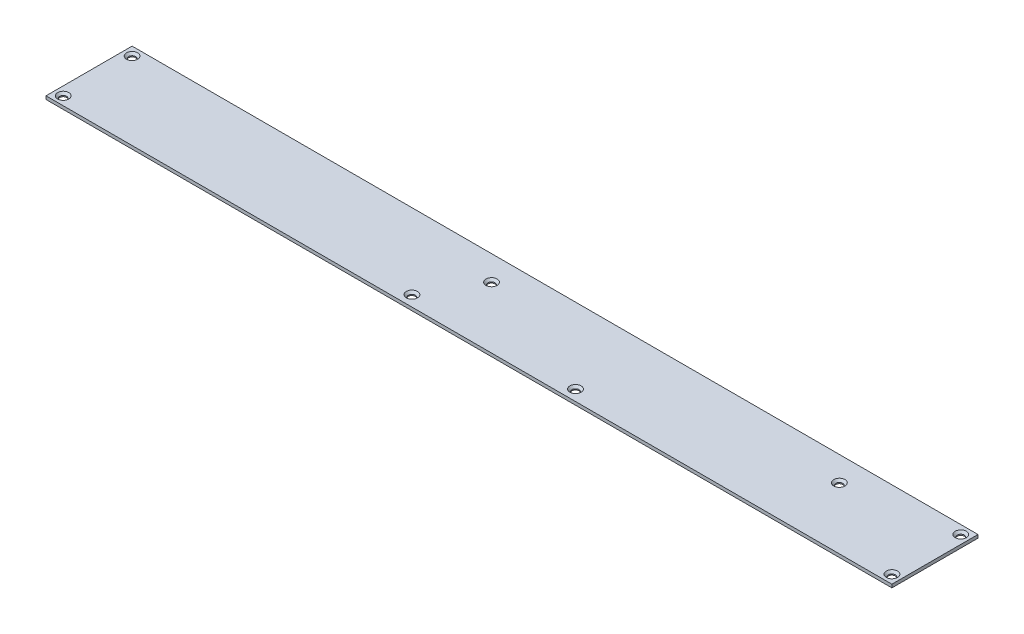
ISO-10303-21;
HEADER;
FILE_DESCRIPTION(('STEP AP214'),'2;1');
FILE_NAME('part.step','',(''),(''),'','','');
FILE_SCHEMA(('AUTOMOTIVE_DESIGN { 1 0 10303 214 1 1 1 1 }'));
ENDSEC;
DATA;
#1=APPLICATION_CONTEXT('core data for automotive mechanical design processes');
#2=APPLICATION_PROTOCOL_DEFINITION('international standard','automotive_design',2000,#1);
#3=PRODUCT_CONTEXT('',#1,'mechanical');
#4=PRODUCT('Part','Part','',(#3));
#5=PRODUCT_RELATED_PRODUCT_CATEGORY('part','',(#4));
#6=PRODUCT_DEFINITION_FORMATION('','',#4);
#7=PRODUCT_DEFINITION_CONTEXT('part definition',#1,'design');
#8=PRODUCT_DEFINITION('design','',#6,#7);
#9=PRODUCT_DEFINITION_SHAPE('','',#8);
#10=(LENGTH_UNIT() NAMED_UNIT(*) SI_UNIT(.MILLI.,.METRE.));
#11=(NAMED_UNIT(*) PLANE_ANGLE_UNIT() SI_UNIT($,.RADIAN.));
#12=(NAMED_UNIT(*) SI_UNIT($,.STERADIAN.) SOLID_ANGLE_UNIT());
#13=UNCERTAINTY_MEASURE_WITH_UNIT(LENGTH_MEASURE(1.E-05),#10,'distance_accuracy_value','');
#14=(GEOMETRIC_REPRESENTATION_CONTEXT(3) GLOBAL_UNCERTAINTY_ASSIGNED_CONTEXT((#13)) GLOBAL_UNIT_ASSIGNED_CONTEXT((#10,
#11,#12)) REPRESENTATION_CONTEXT('',''));
#15=CARTESIAN_POINT('',(0.,0.,0.));
#16=DIRECTION('',(0.,0.,1.));
#17=DIRECTION('',(1.,0.,0.));
#18=AXIS2_PLACEMENT_3D('',#15,#16,#17);
#19=CARTESIAN_POINT('',(0.,1.5,0.));
#20=DIRECTION('',(0.,1.,0.));
#21=DIRECTION('',(0.,0.,1.));
#22=AXIS2_PLACEMENT_3D('',#19,#20,#21);
#23=PLANE('',#22);
#24=CARTESIAN_POINT('',(-18.0000109998269,1.5,-8.50000000000028));
#25=DIRECTION('',(0.,1.,0.));
#26=DIRECTION('',(0.,0.,1.));
#27=AXIS2_PLACEMENT_3D('',#24,#25,#26);
#28=CIRCLE('',#27,2.59999999999994);
#29=CARTESIAN_POINT('',(-18.0000109998269,1.5,-5.90000000000034));
#30=VERTEX_POINT('',#29);
#31=EDGE_CURVE('E147',#30,#30,#28,.F.);
#32=ORIENTED_EDGE('',*,*,#31,.T.);
#33=EDGE_LOOP('',(#32));
#34=FACE_BOUND('',#33,.T.);
#35=CARTESIAN_POINT('',(143.4999640375,1.5,-8.58999977260868));
#36=DIRECTION('',(0.,1.,0.));
#37=DIRECTION('',(0.,0.,1.));
#38=AXIS2_PLACEMENT_3D('',#35,#36,#37);
#39=CIRCLE('',#38,2.59999999999994);
#40=CARTESIAN_POINT('',(143.4999640375,1.5,-5.98999977260874));
#41=VERTEX_POINT('',#40);
#42=EDGE_CURVE('E144',#41,#41,#39,.F.);
#43=ORIENTED_EDGE('',*,*,#42,.T.);
#44=EDGE_LOOP('',(#43));
#45=FACE_BOUND('',#44,.T.);
#46=CARTESIAN_POINT('',(-31.5,1.5,15.));
#47=DIRECTION('',(0.,1.,0.));
#48=DIRECTION('',(0.,0.,1.));
#49=AXIS2_PLACEMENT_3D('',#46,#47,#48);
#50=CIRCLE('',#49,2.59999999999994);
#51=CARTESIAN_POINT('',(-31.5,1.5,17.5999999999999));
#52=VERTEX_POINT('',#51);
#53=EDGE_CURVE('E141',#52,#52,#50,.F.);
#54=ORIENTED_EDGE('',*,*,#53,.T.);
#55=EDGE_LOOP('',(#54));
#56=FACE_BOUND('',#55,.T.);
#57=CARTESIAN_POINT('',(192.5,1.5,-16.));
#58=DIRECTION('',(0.,1.,0.));
#59=DIRECTION('',(0.,0.,1.));
#60=AXIS2_PLACEMENT_3D('',#57,#58,#59);
#61=CIRCLE('',#60,2.59999999999994);
#62=CARTESIAN_POINT('',(192.5,1.5,-13.4000000000001));
#63=VERTEX_POINT('',#62);
#64=EDGE_CURVE('E138',#63,#63,#61,.F.);
#65=ORIENTED_EDGE('',*,*,#64,.T.);
#66=EDGE_LOOP('',(#65));
#67=FACE_BOUND('',#66,.T.);
#68=CARTESIAN_POINT('',(192.5,1.5,16.));
#69=DIRECTION('',(0.,1.,0.));
#70=DIRECTION('',(0.,0.,1.));
#71=AXIS2_PLACEMENT_3D('',#68,#69,#70);
#72=CIRCLE('',#71,2.59999999999999);
#73=CARTESIAN_POINT('',(192.5,1.5,18.6));
#74=VERTEX_POINT('',#73);
#75=EDGE_CURVE('E135',#74,#74,#72,.F.);
#76=ORIENTED_EDGE('',*,*,#75,.T.);
#77=EDGE_LOOP('',(#76));
#78=FACE_BOUND('',#77,.T.);
#79=CARTESIAN_POINT('',(44.5,1.5,15.));
#80=DIRECTION('',(0.,1.,0.));
#81=DIRECTION('',(0.,0.,1.));
#82=AXIS2_PLACEMENT_3D('',#79,#80,#81);
#83=CIRCLE('',#82,2.59999999999994);
#84=CARTESIAN_POINT('',(44.5,1.5,17.5999999999999));
#85=VERTEX_POINT('',#84);
#86=EDGE_CURVE('E132',#85,#85,#83,.F.);
#87=ORIENTED_EDGE('',*,*,#86,.T.);
#88=EDGE_LOOP('',(#87));
#89=FACE_BOUND('',#88,.T.);
#90=CARTESIAN_POINT('',(-192.5,1.5,16.));
#91=DIRECTION('',(0.,1.,0.));
#92=DIRECTION('',(0.,0.,1.));
#93=AXIS2_PLACEMENT_3D('',#90,#91,#92);
#94=CIRCLE('',#93,2.59999999999994);
#95=CARTESIAN_POINT('',(-192.5,1.5,18.5999999999999));
#96=VERTEX_POINT('',#95);
#97=EDGE_CURVE('E129',#96,#96,#94,.F.);
#98=ORIENTED_EDGE('',*,*,#97,.T.);
#99=EDGE_LOOP('',(#98));
#100=FACE_BOUND('',#99,.T.);
#101=CARTESIAN_POINT('',(-192.5,1.5,-16.));
#102=DIRECTION('',(0.,1.,0.));
#103=DIRECTION('',(0.,0.,1.));
#104=AXIS2_PLACEMENT_3D('',#101,#102,#103);
#105=CIRCLE('',#104,2.59999999999999);
#106=CARTESIAN_POINT('',(-192.5,1.5,-13.4));
#107=VERTEX_POINT('',#106);
#108=EDGE_CURVE('E126',#107,#107,#105,.F.);
#109=ORIENTED_EDGE('',*,*,#108,.T.);
#110=EDGE_LOOP('',(#109));
#111=FACE_BOUND('',#110,.T.);
#112=DIRECTION('',(0.,0.,-1.));
#113=VECTOR('',#112,1.);
#114=CARTESIAN_POINT('',(196.5,1.5,-20.));
#115=LINE('',#114,#113);
#116=CARTESIAN_POINT('',(196.5,1.5,20.));
#117=VERTEX_POINT('',#116);
#118=CARTESIAN_POINT('',(196.5,1.5,-20.));
#119=VERTEX_POINT('',#118);
#120=EDGE_CURVE('E93',#117,#119,#115,.T.);
#121=ORIENTED_EDGE('',*,*,#120,.T.);
#122=DIRECTION('',(-1.,0.,0.));
#123=VECTOR('',#122,1.);
#124=CARTESIAN_POINT('',(-196.5,1.5,-20.));
#125=LINE('',#124,#123);
#126=CARTESIAN_POINT('',(-196.5,1.5,-20.));
#127=VERTEX_POINT('',#126);
#128=EDGE_CURVE('E89',#119,#127,#125,.T.);
#129=ORIENTED_EDGE('',*,*,#128,.T.);
#130=DIRECTION('',(0.,0.,1.));
#131=VECTOR('',#130,1.);
#132=CARTESIAN_POINT('',(-196.5,1.5,-20.));
#133=LINE('',#132,#131);
#134=CARTESIAN_POINT('',(-196.5,1.5,20.));
#135=VERTEX_POINT('',#134);
#136=EDGE_CURVE('E91',#127,#135,#133,.T.);
#137=ORIENTED_EDGE('',*,*,#136,.T.);
#138=DIRECTION('',(1.,0.,0.));
#139=VECTOR('',#138,1.);
#140=CARTESIAN_POINT('',(-196.5,1.5,20.));
#141=LINE('',#140,#139);
#142=EDGE_CURVE('E58',#135,#117,#141,.T.);
#143=ORIENTED_EDGE('',*,*,#142,.T.);
#144=EDGE_LOOP('',(#121,#129,#137,#143));
#145=FACE_BOUND('',#144,.T.);
#146=ADVANCED_FACE('F40',(#34,#45,#56,#67,#78,#89,#100,#111,#145),#23,.T.);
#147=CARTESIAN_POINT('',(0.,0.,0.));
#148=DIRECTION('',(0.,1.,0.));
#149=DIRECTION('',(0.,0.,1.));
#150=AXIS2_PLACEMENT_3D('',#147,#148,#149);
#151=PLANE('',#150);
#152=CARTESIAN_POINT('',(192.5,0.,-16.));
#153=DIRECTION('',(0.,1.,0.));
#154=DIRECTION('',(0.,0.,1.));
#155=AXIS2_PLACEMENT_3D('',#152,#153,#154);
#156=CIRCLE('',#155,1.59999999999999);
#157=CARTESIAN_POINT('',(192.5,0.,-14.4));
#158=VERTEX_POINT('',#157);
#159=EDGE_CURVE('E274',#158,#158,#156,.T.);
#160=ORIENTED_EDGE('',*,*,#159,.T.);
#161=EDGE_LOOP('',(#160));
#162=FACE_BOUND('',#161,.T.);
#163=CARTESIAN_POINT('',(192.5,0.,16.));
#164=DIRECTION('',(0.,1.,0.));
#165=DIRECTION('',(0.,0.,1.));
#166=AXIS2_PLACEMENT_3D('',#163,#164,#165);
#167=CIRCLE('',#166,1.59999999999999);
#168=CARTESIAN_POINT('',(192.5,0.,17.6));
#169=VERTEX_POINT('',#168);
#170=EDGE_CURVE('E278',#169,#169,#167,.F.);
#171=ORIENTED_EDGE('',*,*,#170,.F.);
#172=EDGE_LOOP('',(#171));
#173=FACE_BOUND('',#172,.T.);
#174=CARTESIAN_POINT('',(-18.0000109998269,0.,-8.50000000000028));
#175=DIRECTION('',(0.,1.,0.));
#176=DIRECTION('',(0.,0.,1.));
#177=AXIS2_PLACEMENT_3D('',#174,#175,#176);
#178=CIRCLE('',#177,1.6);
#179=CARTESIAN_POINT('',(-18.0000109998269,0.,-6.90000000000028));
#180=VERTEX_POINT('',#179);
#181=EDGE_CURVE('E275',#180,#180,#178,.T.);
#182=ORIENTED_EDGE('',*,*,#181,.T.);
#183=EDGE_LOOP('',(#182));
#184=FACE_BOUND('',#183,.T.);
#185=CARTESIAN_POINT('',(-31.5,0.,15.));
#186=DIRECTION('',(0.,1.,0.));
#187=DIRECTION('',(0.,0.,1.));
#188=AXIS2_PLACEMENT_3D('',#185,#186,#187);
#189=CIRCLE('',#188,1.6);
#190=CARTESIAN_POINT('',(-31.5,0.,16.6));
#191=VERTEX_POINT('',#190);
#192=EDGE_CURVE('E328',#191,#191,#189,.T.);
#193=ORIENTED_EDGE('',*,*,#192,.T.);
#194=EDGE_LOOP('',(#193));
#195=FACE_BOUND('',#194,.T.);
#196=CARTESIAN_POINT('',(-192.5,0.,-16.));
#197=DIRECTION('',(0.,1.,0.));
#198=DIRECTION('',(0.,0.,1.));
#199=AXIS2_PLACEMENT_3D('',#196,#197,#198);
#200=CIRCLE('',#199,1.59999999999999);
#201=CARTESIAN_POINT('',(-192.5,0.,-14.4));
#202=VERTEX_POINT('',#201);
#203=EDGE_CURVE('E113',#202,#202,#200,.F.);
#204=ORIENTED_EDGE('',*,*,#203,.F.);
#205=EDGE_LOOP('',(#204));
#206=FACE_BOUND('',#205,.T.);
#207=DIRECTION('',(0.,0.,-1.));
#208=VECTOR('',#207,1.);
#209=CARTESIAN_POINT('',(196.5,0.,-20.));
#210=LINE('',#209,#208);
#211=CARTESIAN_POINT('',(196.5,0.,20.));
#212=VERTEX_POINT('',#211);
#213=CARTESIAN_POINT('',(196.5,0.,-20.));
#214=VERTEX_POINT('',#213);
#215=EDGE_CURVE('E110',#212,#214,#210,.T.);
#216=ORIENTED_EDGE('',*,*,#215,.F.);
#217=DIRECTION('',(1.,0.,0.));
#218=VECTOR('',#217,1.);
#219=CARTESIAN_POINT('',(-196.5,0.,20.));
#220=LINE('',#219,#218);
#221=CARTESIAN_POINT('',(-196.5,0.,20.));
#222=VERTEX_POINT('',#221);
#223=EDGE_CURVE('E81',#222,#212,#220,.T.);
#224=ORIENTED_EDGE('',*,*,#223,.F.);
#225=DIRECTION('',(0.,0.,1.));
#226=VECTOR('',#225,1.);
#227=CARTESIAN_POINT('',(-196.5,0.,-20.));
#228=LINE('',#227,#226);
#229=CARTESIAN_POINT('',(-196.5,0.,-20.));
#230=VERTEX_POINT('',#229);
#231=EDGE_CURVE('E75',#230,#222,#228,.T.);
#232=ORIENTED_EDGE('',*,*,#231,.F.);
#233=DIRECTION('',(-1.,0.,0.));
#234=VECTOR('',#233,1.);
#235=CARTESIAN_POINT('',(-196.5,0.,-20.));
#236=LINE('',#235,#234);
#237=EDGE_CURVE('E99',#214,#230,#236,.T.);
#238=ORIENTED_EDGE('',*,*,#237,.F.);
#239=EDGE_LOOP('',(#216,#224,#232,#238));
#240=FACE_BOUND('',#239,.T.);
#241=CARTESIAN_POINT('',(143.4999640375,0.,-8.58999977260868));
#242=DIRECTION('',(0.,1.,0.));
#243=DIRECTION('',(0.,0.,1.));
#244=AXIS2_PLACEMENT_3D('',#241,#242,#243);
#245=CIRCLE('',#244,1.59999999999999);
#246=CARTESIAN_POINT('',(143.4999640375,0.,-6.98999977260869));
#247=VERTEX_POINT('',#246);
#248=EDGE_CURVE('E282',#247,#247,#245,.T.);
#249=ORIENTED_EDGE('',*,*,#248,.T.);
#250=EDGE_LOOP('',(#249));
#251=FACE_BOUND('',#250,.T.);
#252=CARTESIAN_POINT('',(-192.5,0.,16.));
#253=DIRECTION('',(0.,1.,0.));
#254=DIRECTION('',(0.,0.,1.));
#255=AXIS2_PLACEMENT_3D('',#252,#253,#254);
#256=CIRCLE('',#255,1.59999999999999);
#257=CARTESIAN_POINT('',(-192.5,0.,17.6));
#258=VERTEX_POINT('',#257);
#259=EDGE_CURVE('E286',#258,#258,#256,.T.);
#260=ORIENTED_EDGE('',*,*,#259,.T.);
#261=EDGE_LOOP('',(#260));
#262=FACE_BOUND('',#261,.T.);
#263=CARTESIAN_POINT('',(44.5,0.,15.));
#264=DIRECTION('',(0.,1.,0.));
#265=DIRECTION('',(0.,0.,1.));
#266=AXIS2_PLACEMENT_3D('',#263,#264,#265);
#267=CIRCLE('',#266,1.6);
#268=CARTESIAN_POINT('',(44.5,0.,16.6));
#269=VERTEX_POINT('',#268);
#270=EDGE_CURVE('E272',#269,#269,#267,.T.);
#271=ORIENTED_EDGE('',*,*,#270,.T.);
#272=EDGE_LOOP('',(#271));
#273=FACE_BOUND('',#272,.T.);
#274=ADVANCED_FACE('F186',(#162,#173,#184,#195,#206,#240,#251,#262,#273),#151,.F.);
#275=CARTESIAN_POINT('',(196.5,1.5,-20.));
#276=DIRECTION('',(-1.,0.,0.));
#277=DIRECTION('',(0.,0.,1.));
#278=AXIS2_PLACEMENT_3D('',#275,#276,#277);
#279=PLANE('',#278);
#280=ORIENTED_EDGE('',*,*,#215,.T.);
#281=DIRECTION('',(0.,-1.,0.));
#282=VECTOR('',#281,1.);
#283=CARTESIAN_POINT('',(196.5,1.5,-20.));
#284=LINE('',#283,#282);
#285=EDGE_CURVE('E100',#119,#214,#284,.T.);
#286=ORIENTED_EDGE('',*,*,#285,.F.);
#287=ORIENTED_EDGE('',*,*,#120,.F.);
#288=DIRECTION('',(0.,-1.,0.));
#289=VECTOR('',#288,1.);
#290=CARTESIAN_POINT('',(196.5,1.5,20.));
#291=LINE('',#290,#289);
#292=EDGE_CURVE('E106',#117,#212,#291,.T.);
#293=ORIENTED_EDGE('',*,*,#292,.T.);
#294=EDGE_LOOP('',(#280,#286,#287,#293));
#295=FACE_BOUND('',#294,.T.);
#296=ADVANCED_FACE('F192',(#295),#279,.F.);
#297=CARTESIAN_POINT('',(-196.5,1.5,-20.));
#298=DIRECTION('',(0.,0.,1.));
#299=DIRECTION('',(1.,0.,0.));
#300=AXIS2_PLACEMENT_3D('',#297,#298,#299);
#301=PLANE('',#300);
#302=ORIENTED_EDGE('',*,*,#237,.T.);
#303=DIRECTION('',(0.,-1.,0.));
#304=VECTOR('',#303,1.);
#305=CARTESIAN_POINT('',(-196.5,1.5,-20.));
#306=LINE('',#305,#304);
#307=EDGE_CURVE('E97',#127,#230,#306,.T.);
#308=ORIENTED_EDGE('',*,*,#307,.F.);
#309=ORIENTED_EDGE('',*,*,#128,.F.);
#310=ORIENTED_EDGE('',*,*,#285,.T.);
#311=EDGE_LOOP('',(#302,#308,#309,#310));
#312=FACE_BOUND('',#311,.T.);
#313=ADVANCED_FACE('F98',(#312),#301,.F.);
#314=CARTESIAN_POINT('',(-196.5,1.5,-20.));
#315=DIRECTION('',(1.,0.,0.));
#316=DIRECTION('',(0.,0.,-1.));
#317=AXIS2_PLACEMENT_3D('',#314,#315,#316);
#318=PLANE('',#317);
#319=ORIENTED_EDGE('',*,*,#231,.T.);
#320=DIRECTION('',(0.,-1.,0.));
#321=VECTOR('',#320,1.);
#322=CARTESIAN_POINT('',(-196.5,1.5,20.));
#323=LINE('',#322,#321);
#324=EDGE_CURVE('E101',#135,#222,#323,.T.);
#325=ORIENTED_EDGE('',*,*,#324,.F.);
#326=ORIENTED_EDGE('',*,*,#136,.F.);
#327=ORIENTED_EDGE('',*,*,#307,.T.);
#328=EDGE_LOOP('',(#319,#325,#326,#327));
#329=FACE_BOUND('',#328,.T.);
#330=ADVANCED_FACE('F103',(#329),#318,.F.);
#331=CARTESIAN_POINT('',(-196.5,1.5,20.));
#332=DIRECTION('',(0.,0.,-1.));
#333=DIRECTION('',(-1.,0.,0.));
#334=AXIS2_PLACEMENT_3D('',#331,#332,#333);
#335=PLANE('',#334);
#336=ORIENTED_EDGE('',*,*,#223,.T.);
#337=ORIENTED_EDGE('',*,*,#292,.F.);
#338=ORIENTED_EDGE('',*,*,#142,.F.);
#339=ORIENTED_EDGE('',*,*,#324,.T.);
#340=EDGE_LOOP('',(#336,#337,#338,#339));
#341=FACE_BOUND('',#340,.T.);
#342=ADVANCED_FACE('F200',(#341),#335,.F.);
#343=CARTESIAN_POINT('',(-192.5,0.,-16.));
#344=DIRECTION('',(0.,1.,0.));
#345=DIRECTION('',(0.,0.,1.));
#346=AXIS2_PLACEMENT_3D('',#343,#344,#345);
#347=CYLINDRICAL_SURFACE('',#346,1.59999999999999);
#348=CARTESIAN_POINT('',(-192.5,0.500000000000005,-16.));
#349=DIRECTION('',(0.,1.,0.));
#350=DIRECTION('',(0.,0.,1.));
#351=AXIS2_PLACEMENT_3D('',#348,#349,#350);
#352=CIRCLE('',#351,1.59999999999999);
#353=CARTESIAN_POINT('',(-192.5,0.500000000000005,-14.4));
#354=VERTEX_POINT('',#353);
#355=EDGE_CURVE('E11',#354,#354,#352,.T.);
#356=ORIENTED_EDGE('',*,*,#355,.T.);
#357=EDGE_LOOP('',(#356));
#358=FACE_BOUND('',#357,.T.);
#359=ORIENTED_EDGE('',*,*,#203,.T.);
#360=EDGE_LOOP('',(#359));
#361=FACE_BOUND('',#360,.T.);
#362=ADVANCED_FACE('F197',(#358,#361),#347,.F.);
#363=CARTESIAN_POINT('',(-31.5,0.,15.));
#364=DIRECTION('',(0.,1.,0.));
#365=DIRECTION('',(0.,0.,1.));
#366=AXIS2_PLACEMENT_3D('',#363,#364,#365);
#367=CYLINDRICAL_SURFACE('',#366,1.6);
#368=CARTESIAN_POINT('',(-31.5,0.500000000000005,15.));
#369=DIRECTION('',(0.,1.,0.));
#370=DIRECTION('',(0.,0.,1.));
#371=AXIS2_PLACEMENT_3D('',#368,#369,#370);
#372=CIRCLE('',#371,1.6);
#373=CARTESIAN_POINT('',(-31.5,0.500000000000005,16.6));
#374=VERTEX_POINT('',#373);
#375=EDGE_CURVE('E154',#374,#374,#372,.T.);
#376=ORIENTED_EDGE('',*,*,#375,.T.);
#377=EDGE_LOOP('',(#376));
#378=FACE_BOUND('',#377,.T.);
#379=ORIENTED_EDGE('',*,*,#192,.F.);
#380=EDGE_LOOP('',(#379));
#381=FACE_BOUND('',#380,.T.);
#382=ADVANCED_FACE('F318',(#378,#381),#367,.F.);
#383=CARTESIAN_POINT('',(143.4999640375,0.,-8.58999977260868));
#384=DIRECTION('',(0.,1.,0.));
#385=DIRECTION('',(0.,0.,1.));
#386=AXIS2_PLACEMENT_3D('',#383,#384,#385);
#387=CYLINDRICAL_SURFACE('',#386,1.59999999999999);
#388=CARTESIAN_POINT('',(143.4999640375,0.499999999999994,-8.58999977260868));
#389=DIRECTION('',(0.,1.,0.));
#390=DIRECTION('',(0.,0.,1.));
#391=AXIS2_PLACEMENT_3D('',#388,#389,#390);
#392=CIRCLE('',#391,1.59999999999999);
#393=CARTESIAN_POINT('',(143.4999640375,0.499999999999994,-6.98999977260869));
#394=VERTEX_POINT('',#393);
#395=EDGE_CURVE('E151',#394,#394,#392,.T.);
#396=ORIENTED_EDGE('',*,*,#395,.T.);
#397=EDGE_LOOP('',(#396));
#398=FACE_BOUND('',#397,.T.);
#399=ORIENTED_EDGE('',*,*,#248,.F.);
#400=EDGE_LOOP('',(#399));
#401=FACE_BOUND('',#400,.T.);
#402=ADVANCED_FACE('F311',(#398,#401),#387,.F.);
#403=CARTESIAN_POINT('',(-18.0000109998269,0.,-8.50000000000028));
#404=DIRECTION('',(0.,1.,0.));
#405=DIRECTION('',(0.,0.,1.));
#406=AXIS2_PLACEMENT_3D('',#403,#404,#405);
#407=CYLINDRICAL_SURFACE('',#406,1.6);
#408=CARTESIAN_POINT('',(-18.0000109998269,0.500000000000005,-8.50000000000028));
#409=DIRECTION('',(0.,1.,0.));
#410=DIRECTION('',(0.,0.,1.));
#411=AXIS2_PLACEMENT_3D('',#408,#409,#410);
#412=CIRCLE('',#411,1.6);
#413=CARTESIAN_POINT('',(-18.0000109998269,0.500000000000005,-6.90000000000028));
#414=VERTEX_POINT('',#413);
#415=EDGE_CURVE('E122',#414,#414,#412,.T.);
#416=ORIENTED_EDGE('',*,*,#415,.T.);
#417=EDGE_LOOP('',(#416));
#418=FACE_BOUND('',#417,.T.);
#419=ORIENTED_EDGE('',*,*,#181,.F.);
#420=EDGE_LOOP('',(#419));
#421=FACE_BOUND('',#420,.T.);
#422=ADVANCED_FACE('F304',(#418,#421),#407,.F.);
#423=CARTESIAN_POINT('',(-192.5,0.,16.));
#424=DIRECTION('',(0.,1.,0.));
#425=DIRECTION('',(0.,0.,1.));
#426=AXIS2_PLACEMENT_3D('',#423,#424,#425);
#427=CYLINDRICAL_SURFACE('',#426,1.59999999999999);
#428=CARTESIAN_POINT('',(-192.5,0.499999999999994,16.));
#429=DIRECTION('',(0.,1.,0.));
#430=DIRECTION('',(0.,0.,1.));
#431=AXIS2_PLACEMENT_3D('',#428,#429,#430);
#432=CIRCLE('',#431,1.59999999999999);
#433=CARTESIAN_POINT('',(-192.5,0.499999999999994,17.6));
#434=VERTEX_POINT('',#433);
#435=EDGE_CURVE('E50',#434,#434,#432,.T.);
#436=ORIENTED_EDGE('',*,*,#435,.T.);
#437=EDGE_LOOP('',(#436));
#438=FACE_BOUND('',#437,.T.);
#439=ORIENTED_EDGE('',*,*,#259,.F.);
#440=EDGE_LOOP('',(#439));
#441=FACE_BOUND('',#440,.T.);
#442=ADVANCED_FACE('F168',(#438,#441),#427,.F.);
#443=CARTESIAN_POINT('',(192.5,0.,16.));
#444=DIRECTION('',(0.,1.,0.));
#445=DIRECTION('',(0.,0.,1.));
#446=AXIS2_PLACEMENT_3D('',#443,#444,#445);
#447=CYLINDRICAL_SURFACE('',#446,1.59999999999999);
#448=CARTESIAN_POINT('',(192.5,0.500000000000005,16.));
#449=DIRECTION('',(0.,1.,0.));
#450=DIRECTION('',(0.,0.,1.));
#451=AXIS2_PLACEMENT_3D('',#448,#449,#450);
#452=CIRCLE('',#451,1.59999999999999);
#453=CARTESIAN_POINT('',(192.5,0.500000000000005,17.6));
#454=VERTEX_POINT('',#453);
#455=EDGE_CURVE('E160',#454,#454,#452,.T.);
#456=ORIENTED_EDGE('',*,*,#455,.T.);
#457=EDGE_LOOP('',(#456));
#458=FACE_BOUND('',#457,.T.);
#459=ORIENTED_EDGE('',*,*,#170,.T.);
#460=EDGE_LOOP('',(#459));
#461=FACE_BOUND('',#460,.T.);
#462=ADVANCED_FACE('F303',(#458,#461),#447,.F.);
#463=CARTESIAN_POINT('',(192.5,0.,-16.));
#464=DIRECTION('',(0.,1.,0.));
#465=DIRECTION('',(0.,0.,1.));
#466=AXIS2_PLACEMENT_3D('',#463,#464,#465);
#467=CYLINDRICAL_SURFACE('',#466,1.59999999999999);
#468=CARTESIAN_POINT('',(192.5,0.499999999999994,-16.));
#469=DIRECTION('',(0.,1.,0.));
#470=DIRECTION('',(0.,0.,1.));
#471=AXIS2_PLACEMENT_3D('',#468,#469,#470);
#472=CIRCLE('',#471,1.59999999999999);
#473=CARTESIAN_POINT('',(192.5,0.499999999999994,-14.4));
#474=VERTEX_POINT('',#473);
#475=EDGE_CURVE('E157',#474,#474,#472,.T.);
#476=ORIENTED_EDGE('',*,*,#475,.T.);
#477=EDGE_LOOP('',(#476));
#478=FACE_BOUND('',#477,.T.);
#479=ORIENTED_EDGE('',*,*,#159,.F.);
#480=EDGE_LOOP('',(#479));
#481=FACE_BOUND('',#480,.T.);
#482=ADVANCED_FACE('F268',(#478,#481),#467,.F.);
#483=CARTESIAN_POINT('',(44.5,0.,15.));
#484=DIRECTION('',(0.,1.,0.));
#485=DIRECTION('',(0.,0.,1.));
#486=AXIS2_PLACEMENT_3D('',#483,#484,#485);
#487=CYLINDRICAL_SURFACE('',#486,1.6);
#488=CARTESIAN_POINT('',(44.5,0.500000000000008,15.));
#489=DIRECTION('',(0.,1.,0.));
#490=DIRECTION('',(0.,0.,1.));
#491=AXIS2_PLACEMENT_3D('',#488,#489,#490);
#492=CIRCLE('',#491,1.6);
#493=CARTESIAN_POINT('',(44.5,0.500000000000008,16.6));
#494=VERTEX_POINT('',#493);
#495=EDGE_CURVE('E163',#494,#494,#492,.T.);
#496=ORIENTED_EDGE('',*,*,#495,.T.);
#497=EDGE_LOOP('',(#496));
#498=FACE_BOUND('',#497,.T.);
#499=ORIENTED_EDGE('',*,*,#270,.F.);
#500=EDGE_LOOP('',(#499));
#501=FACE_BOUND('',#500,.T.);
#502=ADVANCED_FACE('F218',(#498,#501),#487,.F.);
#503=CARTESIAN_POINT('',(-18.0000109998269,0.500000000000005,-8.50000000000028));
#504=DIRECTION('',(0.,1.,0.));
#505=DIRECTION('',(0.,0.,1.));
#506=AXIS2_PLACEMENT_3D('',#503,#504,#505);
#507=CONICAL_SURFACE('',#506,1.6,0.785398163397418);
#508=ORIENTED_EDGE('',*,*,#31,.F.);
#509=EDGE_LOOP('',(#508));
#510=FACE_BOUND('',#509,.T.);
#511=ORIENTED_EDGE('',*,*,#415,.F.);
#512=EDGE_LOOP('',(#511));
#513=FACE_BOUND('',#512,.T.);
#514=ADVANCED_FACE('F211',(#510,#513),#507,.F.);
#515=CARTESIAN_POINT('',(143.4999640375,0.499999999999994,-8.58999977260868));
#516=DIRECTION('',(0.,1.,0.));
#517=DIRECTION('',(0.,0.,1.));
#518=AXIS2_PLACEMENT_3D('',#515,#516,#517);
#519=CONICAL_SURFACE('',#518,1.59999999999999,0.785398163397418);
#520=ORIENTED_EDGE('',*,*,#42,.F.);
#521=EDGE_LOOP('',(#520));
#522=FACE_BOUND('',#521,.T.);
#523=ORIENTED_EDGE('',*,*,#395,.F.);
#524=EDGE_LOOP('',(#523));
#525=FACE_BOUND('',#524,.T.);
#526=ADVANCED_FACE('F217',(#522,#525),#519,.F.);
#527=CARTESIAN_POINT('',(-31.5,0.500000000000005,15.));
#528=DIRECTION('',(0.,1.,0.));
#529=DIRECTION('',(0.,0.,1.));
#530=AXIS2_PLACEMENT_3D('',#527,#528,#529);
#531=CONICAL_SURFACE('',#530,1.6,0.785398163397418);
#532=ORIENTED_EDGE('',*,*,#53,.F.);
#533=EDGE_LOOP('',(#532));
#534=FACE_BOUND('',#533,.T.);
#535=ORIENTED_EDGE('',*,*,#375,.F.);
#536=EDGE_LOOP('',(#535));
#537=FACE_BOUND('',#536,.T.);
#538=ADVANCED_FACE('F225',(#534,#537),#531,.F.);
#539=CARTESIAN_POINT('',(192.5,0.499999999999994,-16.));
#540=DIRECTION('',(0.,1.,0.));
#541=DIRECTION('',(0.,0.,1.));
#542=AXIS2_PLACEMENT_3D('',#539,#540,#541);
#543=CONICAL_SURFACE('',#542,1.59999999999999,0.785398163397418);
#544=ORIENTED_EDGE('',*,*,#64,.F.);
#545=EDGE_LOOP('',(#544));
#546=FACE_BOUND('',#545,.T.);
#547=ORIENTED_EDGE('',*,*,#475,.F.);
#548=EDGE_LOOP('',(#547));
#549=FACE_BOUND('',#548,.T.);
#550=ADVANCED_FACE('F232',(#546,#549),#543,.F.);
#551=CARTESIAN_POINT('',(192.5,1.5,16.));
#552=DIRECTION('',(0.,1.,0.));
#553=DIRECTION('',(0.,0.,1.));
#554=AXIS2_PLACEMENT_3D('',#551,#552,#553);
#555=CONICAL_SURFACE('',#554,2.59999999999999,0.785398163397451);
#556=ORIENTED_EDGE('',*,*,#455,.F.);
#557=EDGE_LOOP('',(#556));
#558=FACE_BOUND('',#557,.T.);
#559=ORIENTED_EDGE('',*,*,#75,.F.);
#560=EDGE_LOOP('',(#559));
#561=FACE_BOUND('',#560,.T.);
#562=ADVANCED_FACE('F180',(#558,#561),#555,.F.);
#563=CARTESIAN_POINT('',(44.5,0.500000000000008,15.));
#564=DIRECTION('',(0.,1.,0.));
#565=DIRECTION('',(0.,0.,1.));
#566=AXIS2_PLACEMENT_3D('',#563,#564,#565);
#567=CONICAL_SURFACE('',#566,1.6,0.785398163397418);
#568=ORIENTED_EDGE('',*,*,#86,.F.);
#569=EDGE_LOOP('',(#568));
#570=FACE_BOUND('',#569,.T.);
#571=ORIENTED_EDGE('',*,*,#495,.F.);
#572=EDGE_LOOP('',(#571));
#573=FACE_BOUND('',#572,.T.);
#574=ADVANCED_FACE('F173',(#570,#573),#567,.F.);
#575=CARTESIAN_POINT('',(-192.5,0.499999999999994,16.));
#576=DIRECTION('',(0.,1.,0.));
#577=DIRECTION('',(0.,0.,1.));
#578=AXIS2_PLACEMENT_3D('',#575,#576,#577);
#579=CONICAL_SURFACE('',#578,1.59999999999999,0.785398163397418);
#580=ORIENTED_EDGE('',*,*,#97,.F.);
#581=EDGE_LOOP('',(#580));
#582=FACE_BOUND('',#581,.T.);
#583=ORIENTED_EDGE('',*,*,#435,.F.);
#584=EDGE_LOOP('',(#583));
#585=FACE_BOUND('',#584,.T.);
#586=ADVANCED_FACE('F171',(#582,#585),#579,.F.);
#587=CARTESIAN_POINT('',(-192.5,1.5,-16.));
#588=DIRECTION('',(0.,1.,0.));
#589=DIRECTION('',(0.,0.,1.));
#590=AXIS2_PLACEMENT_3D('',#587,#588,#589);
#591=CONICAL_SURFACE('',#590,2.59999999999999,0.785398163397451);
#592=ORIENTED_EDGE('',*,*,#355,.F.);
#593=EDGE_LOOP('',(#592));
#594=FACE_BOUND('',#593,.T.);
#595=ORIENTED_EDGE('',*,*,#108,.F.);
#596=EDGE_LOOP('',(#595));
#597=FACE_BOUND('',#596,.T.);
#598=ADVANCED_FACE('F43',(#594,#597),#591,.F.);
#599=CLOSED_SHELL('',(#146,#274,#296,#313,#330,#342,#362,#382,#402,#422,#442,#462,#482,#502,
#514,#526,#538,#550,#562,#574,#586,#598));
#600=MANIFOLD_SOLID_BREP('B2',#599);
#601=ADVANCED_BREP_SHAPE_REPRESENTATION('',(#18,#600),#14);
#602=SHAPE_DEFINITION_REPRESENTATION(#9,#601);
ENDSEC;
END-ISO-10303-21;
